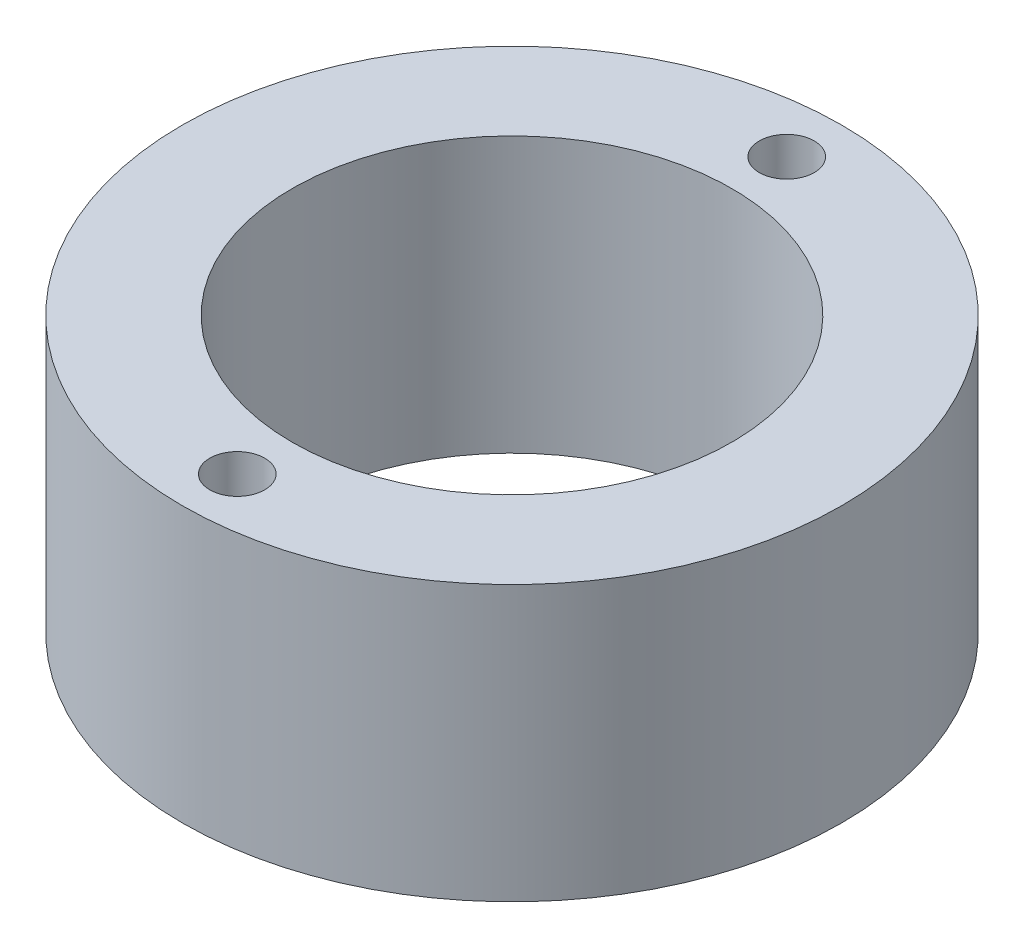
ISO-10303-21;
HEADER;
FILE_DESCRIPTION(('STEP AP214'),'2;1');
FILE_NAME('part.step','',(''),(''),'','','');
FILE_SCHEMA(('AUTOMOTIVE_DESIGN { 1 0 10303 214 1 1 1 1 }'));
ENDSEC;
DATA;
#1=APPLICATION_CONTEXT('core data for automotive mechanical design processes');
#2=APPLICATION_PROTOCOL_DEFINITION('international standard','automotive_design',2000,#1);
#3=PRODUCT_CONTEXT('',#1,'mechanical');
#4=PRODUCT('Part','Part','',(#3));
#5=PRODUCT_RELATED_PRODUCT_CATEGORY('part','',(#4));
#6=PRODUCT_DEFINITION_FORMATION('','',#4);
#7=PRODUCT_DEFINITION_CONTEXT('part definition',#1,'design');
#8=PRODUCT_DEFINITION('design','',#6,#7);
#9=PRODUCT_DEFINITION_SHAPE('','',#8);
#10=(LENGTH_UNIT() NAMED_UNIT(*) SI_UNIT(.MILLI.,.METRE.));
#11=(NAMED_UNIT(*) PLANE_ANGLE_UNIT() SI_UNIT($,.RADIAN.));
#12=(NAMED_UNIT(*) SI_UNIT($,.STERADIAN.) SOLID_ANGLE_UNIT());
#13=UNCERTAINTY_MEASURE_WITH_UNIT(LENGTH_MEASURE(1.E-05),#10,'distance_accuracy_value','');
#14=(GEOMETRIC_REPRESENTATION_CONTEXT(3) GLOBAL_UNCERTAINTY_ASSIGNED_CONTEXT((#13)) GLOBAL_UNIT_ASSIGNED_CONTEXT((#10,
#11,#12)) REPRESENTATION_CONTEXT('',''));
#15=CARTESIAN_POINT('',(0.,0.,0.));
#16=DIRECTION('',(0.,0.,1.));
#17=DIRECTION('',(1.,0.,0.));
#18=AXIS2_PLACEMENT_3D('',#15,#16,#17);
#19=CARTESIAN_POINT('',(0.,5.,0.));
#20=DIRECTION('',(0.,1.,0.));
#21=DIRECTION('',(0.,0.,1.));
#22=AXIS2_PLACEMENT_3D('',#19,#20,#21);
#23=PLANE('',#22);
#24=CARTESIAN_POINT('',(0.,5.,-5.));
#25=DIRECTION('',(0.,1.,0.));
#26=DIRECTION('',(0.,0.,1.));
#27=AXIS2_PLACEMENT_3D('',#24,#25,#26);
#28=CIRCLE('',#27,0.5);
#29=CARTESIAN_POINT('',(0.,5.,-4.5));
#30=VERTEX_POINT('',#29);
#31=EDGE_CURVE('E46',#30,#30,#28,.T.);
#32=ORIENTED_EDGE('',*,*,#31,.F.);
#33=EDGE_LOOP('',(#32));
#34=FACE_BOUND('',#33,.T.);
#35=CARTESIAN_POINT('',(0.,5.,0.));
#36=DIRECTION('',(0.,1.,0.));
#37=DIRECTION('',(0.,0.,1.));
#38=AXIS2_PLACEMENT_3D('',#35,#36,#37);
#39=CIRCLE('',#38,6.);
#40=CARTESIAN_POINT('',(0.,5.,6.));
#41=VERTEX_POINT('',#40);
#42=EDGE_CURVE('E10',#41,#41,#39,.T.);
#43=ORIENTED_EDGE('',*,*,#42,.T.);
#44=EDGE_LOOP('',(#43));
#45=FACE_BOUND('',#44,.T.);
#46=CARTESIAN_POINT('',(0.,5.,0.));
#47=DIRECTION('',(0.,1.,0.));
#48=DIRECTION('',(0.,0.,1.));
#49=AXIS2_PLACEMENT_3D('',#46,#47,#48);
#50=CIRCLE('',#49,4.);
#51=CARTESIAN_POINT('',(0.,5.,4.));
#52=VERTEX_POINT('',#51);
#53=EDGE_CURVE('E41',#52,#52,#50,.T.);
#54=ORIENTED_EDGE('',*,*,#53,.F.);
#55=EDGE_LOOP('',(#54));
#56=FACE_BOUND('',#55,.T.);
#57=CARTESIAN_POINT('',(0.,5.,5.));
#58=DIRECTION('',(0.,1.,0.));
#59=DIRECTION('',(0.,0.,1.));
#60=AXIS2_PLACEMENT_3D('',#57,#58,#59);
#61=CIRCLE('',#60,0.5);
#62=CARTESIAN_POINT('',(0.,5.,5.5));
#63=VERTEX_POINT('',#62);
#64=EDGE_CURVE('E52',#63,#63,#61,.T.);
#65=ORIENTED_EDGE('',*,*,#64,.F.);
#66=EDGE_LOOP('',(#65));
#67=FACE_BOUND('',#66,.T.);
#68=ADVANCED_FACE('F30',(#34,#45,#56,#67),#23,.T.);
#69=CARTESIAN_POINT('',(0.,0.,0.));
#70=DIRECTION('',(0.,1.,0.));
#71=DIRECTION('',(0.,0.,1.));
#72=AXIS2_PLACEMENT_3D('',#69,#70,#71);
#73=PLANE('',#72);
#74=CARTESIAN_POINT('',(0.,0.,0.));
#75=DIRECTION('',(0.,1.,0.));
#76=DIRECTION('',(0.,0.,1.));
#77=AXIS2_PLACEMENT_3D('',#74,#75,#76);
#78=CIRCLE('',#77,6.);
#79=CARTESIAN_POINT('',(0.,0.,6.));
#80=VERTEX_POINT('',#79);
#81=EDGE_CURVE('E34',#80,#80,#78,.T.);
#82=ORIENTED_EDGE('',*,*,#81,.F.);
#83=EDGE_LOOP('',(#82));
#84=FACE_BOUND('',#83,.T.);
#85=CARTESIAN_POINT('',(0.,0.,0.));
#86=DIRECTION('',(0.,1.,0.));
#87=DIRECTION('',(0.,0.,1.));
#88=AXIS2_PLACEMENT_3D('',#85,#86,#87);
#89=CIRCLE('',#88,4.);
#90=CARTESIAN_POINT('',(0.,0.,4.));
#91=VERTEX_POINT('',#90);
#92=EDGE_CURVE('E43',#91,#91,#89,.T.);
#93=ORIENTED_EDGE('',*,*,#92,.T.);
#94=EDGE_LOOP('',(#93));
#95=FACE_BOUND('',#94,.T.);
#96=CARTESIAN_POINT('',(0.,0.,-5.));
#97=DIRECTION('',(0.,1.,0.));
#98=DIRECTION('',(0.,0.,1.));
#99=AXIS2_PLACEMENT_3D('',#96,#97,#98);
#100=CIRCLE('',#99,0.5);
#101=CARTESIAN_POINT('',(0.,0.,-4.5));
#102=VERTEX_POINT('',#101);
#103=EDGE_CURVE('E49',#102,#102,#100,.T.);
#104=ORIENTED_EDGE('',*,*,#103,.T.);
#105=EDGE_LOOP('',(#104));
#106=FACE_BOUND('',#105,.T.);
#107=CARTESIAN_POINT('',(0.,0.,5.));
#108=DIRECTION('',(0.,1.,0.));
#109=DIRECTION('',(0.,0.,1.));
#110=AXIS2_PLACEMENT_3D('',#107,#108,#109);
#111=CIRCLE('',#110,0.5);
#112=CARTESIAN_POINT('',(0.,0.,5.5));
#113=VERTEX_POINT('',#112);
#114=EDGE_CURVE('E55',#113,#113,#111,.T.);
#115=ORIENTED_EDGE('',*,*,#114,.T.);
#116=EDGE_LOOP('',(#115));
#117=FACE_BOUND('',#116,.T.);
#118=ADVANCED_FACE('F65',(#84,#95,#106,#117),#73,.F.);
#119=CARTESIAN_POINT('',(0.,5.,0.));
#120=DIRECTION('',(0.,-1.,0.));
#121=DIRECTION('',(0.,0.,-1.));
#122=AXIS2_PLACEMENT_3D('',#119,#120,#121);
#123=CYLINDRICAL_SURFACE('',#122,6.);
#124=ORIENTED_EDGE('',*,*,#42,.F.);
#125=EDGE_LOOP('',(#124));
#126=FACE_BOUND('',#125,.T.);
#127=ORIENTED_EDGE('',*,*,#81,.T.);
#128=EDGE_LOOP('',(#127));
#129=FACE_BOUND('',#128,.T.);
#130=ADVANCED_FACE('F32',(#126,#129),#123,.T.);
#131=CARTESIAN_POINT('',(0.,5.,0.));
#132=DIRECTION('',(0.,-1.,0.));
#133=DIRECTION('',(0.,0.,-1.));
#134=AXIS2_PLACEMENT_3D('',#131,#132,#133);
#135=CYLINDRICAL_SURFACE('',#134,4.);
#136=ORIENTED_EDGE('',*,*,#53,.T.);
#137=EDGE_LOOP('',(#136));
#138=FACE_BOUND('',#137,.T.);
#139=ORIENTED_EDGE('',*,*,#92,.F.);
#140=EDGE_LOOP('',(#139));
#141=FACE_BOUND('',#140,.T.);
#142=ADVANCED_FACE('F74',(#138,#141),#135,.F.);
#143=CARTESIAN_POINT('',(0.,5.,-5.));
#144=DIRECTION('',(0.,-1.,0.));
#145=DIRECTION('',(0.,0.,-1.));
#146=AXIS2_PLACEMENT_3D('',#143,#144,#145);
#147=CYLINDRICAL_SURFACE('',#146,0.5);
#148=ORIENTED_EDGE('',*,*,#31,.T.);
#149=EDGE_LOOP('',(#148));
#150=FACE_BOUND('',#149,.T.);
#151=ORIENTED_EDGE('',*,*,#103,.F.);
#152=EDGE_LOOP('',(#151));
#153=FACE_BOUND('',#152,.T.);
#154=ADVANCED_FACE('F77',(#150,#153),#147,.F.);
#155=CARTESIAN_POINT('',(0.,5.,5.));
#156=DIRECTION('',(0.,-1.,0.));
#157=DIRECTION('',(0.,0.,-1.));
#158=AXIS2_PLACEMENT_3D('',#155,#156,#157);
#159=CYLINDRICAL_SURFACE('',#158,0.5);
#160=ORIENTED_EDGE('',*,*,#64,.T.);
#161=EDGE_LOOP('',(#160));
#162=FACE_BOUND('',#161,.T.);
#163=ORIENTED_EDGE('',*,*,#114,.F.);
#164=EDGE_LOOP('',(#163));
#165=FACE_BOUND('',#164,.T.);
#166=ADVANCED_FACE('F61',(#162,#165),#159,.F.);
#167=CLOSED_SHELL('',(#68,#118,#130,#142,#154,#166));
#168=MANIFOLD_SOLID_BREP('B2',#167);
#169=ADVANCED_BREP_SHAPE_REPRESENTATION('',(#18,#168),#14);
#170=SHAPE_DEFINITION_REPRESENTATION(#9,#169);
ENDSEC;
END-ISO-10303-21;
